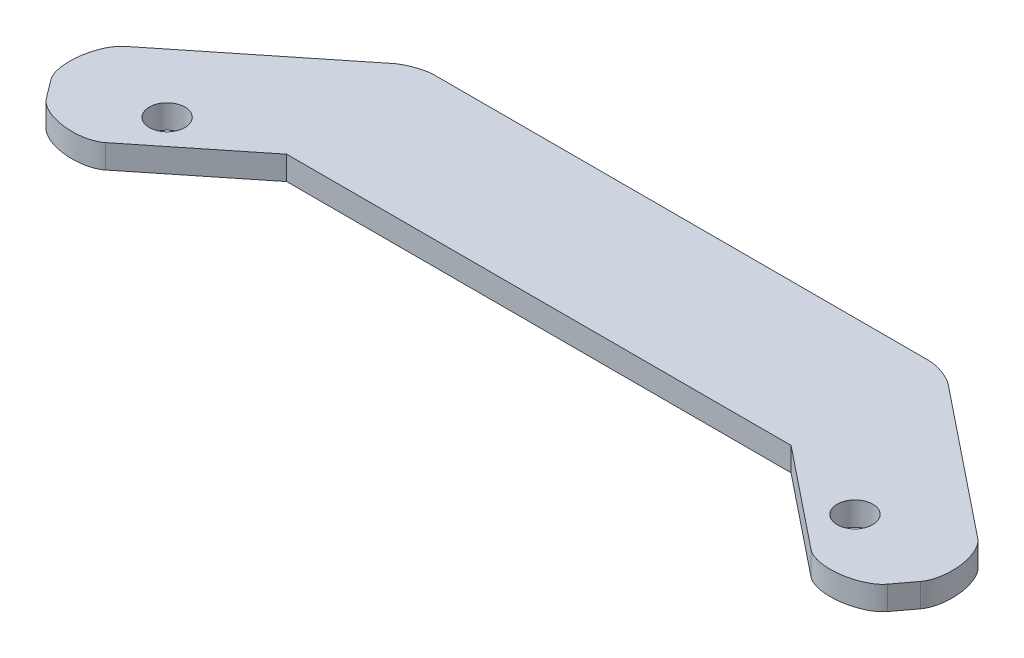
ISO-10303-21;
HEADER;
FILE_DESCRIPTION(('STEP AP214'),'2;1');
FILE_NAME('part.step','',(''),(''),'','','');
FILE_SCHEMA(('AUTOMOTIVE_DESIGN { 1 0 10303 214 1 1 1 1 }'));
ENDSEC;
DATA;
#1=APPLICATION_CONTEXT('core data for automotive mechanical design processes');
#2=APPLICATION_PROTOCOL_DEFINITION('international standard','automotive_design',2000,#1);
#3=PRODUCT_CONTEXT('',#1,'mechanical');
#4=PRODUCT('Part','Part','',(#3));
#5=PRODUCT_RELATED_PRODUCT_CATEGORY('part','',(#4));
#6=PRODUCT_DEFINITION_FORMATION('','',#4);
#7=PRODUCT_DEFINITION_CONTEXT('part definition',#1,'design');
#8=PRODUCT_DEFINITION('design','',#6,#7);
#9=PRODUCT_DEFINITION_SHAPE('','',#8);
#10=(LENGTH_UNIT() NAMED_UNIT(*) SI_UNIT(.MILLI.,.METRE.));
#11=(NAMED_UNIT(*) PLANE_ANGLE_UNIT() SI_UNIT($,.RADIAN.));
#12=(NAMED_UNIT(*) SI_UNIT($,.STERADIAN.) SOLID_ANGLE_UNIT());
#13=UNCERTAINTY_MEASURE_WITH_UNIT(LENGTH_MEASURE(1.E-05),#10,'distance_accuracy_value','');
#14=(GEOMETRIC_REPRESENTATION_CONTEXT(3) GLOBAL_UNCERTAINTY_ASSIGNED_CONTEXT((#13)) GLOBAL_UNIT_ASSIGNED_CONTEXT((#10,
#11,#12)) REPRESENTATION_CONTEXT('',''));
#15=CARTESIAN_POINT('',(0.,0.,0.));
#16=DIRECTION('',(0.,0.,1.));
#17=DIRECTION('',(1.,0.,0.));
#18=AXIS2_PLACEMENT_3D('',#15,#16,#17);
#19=CARTESIAN_POINT('',(0.,1.5875,0.));
#20=DIRECTION('',(0.,-1.,0.));
#21=DIRECTION('',(0.,0.,-1.));
#22=AXIS2_PLACEMENT_3D('',#19,#20,#21);
#23=PLANE('',#22);
#24=DIRECTION('',(0.599692544176587,0.,0.800230499580597));
#25=VECTOR('',#24,1.);
#26=CARTESIAN_POINT('',(-22.9293114019376,1.5875,-25.6132230924464));
#27=LINE('',#26,#25);
#28=CARTESIAN_POINT('',(-25.8477889660056,1.5875,-29.5076432945779));
#29=VERTEX_POINT('',#28);
#30=CARTESIAN_POINT('',(-24.8952889660056,1.5875,-28.23662607375));
#31=VERTEX_POINT('',#30);
#32=EDGE_CURVE('E168',#29,#31,#27,.T.);
#33=ORIENTED_EDGE('',*,*,#32,.T.);
#34=CARTESIAN_POINT('',(-20.3701821298372,1.5875,-27.6621663208963));
#35=CARTESIAN_POINT('',(-22.9293114019376,1.5875,-25.6132230924464));
#36=CARTESIAN_POINT('',(-24.8952889660056,1.5875,-28.23662607375));
#37=(BOUNDED_CURVE() B_SPLINE_CURVE(2,(#34,#35,#36),.UNSPECIFIED.,.F.,
.F.) B_SPLINE_CURVE_WITH_KNOTS((3,3),(0.,1.),
.UNSPECIFIED.) CURVE() GEOMETRIC_REPRESENTATION_ITEM() RATIONAL_B_SPLINE_CURVE((1.,
0.448951306137657,1.)) REPRESENTATION_ITEM(''));
#38=CARTESIAN_POINT('',(-20.3701821298372,1.5875,-27.6621663208963));
#39=VERTEX_POINT('',#38);
#40=EDGE_CURVE('E162',#31,#39,#37,.F.);
#41=ORIENTED_EDGE('',*,*,#40,.T.);
#42=DIRECTION('',(0.780624749799801,0.,-0.624999999999998));
#43=VECTOR('',#42,1.);
#44=CARTESIAN_POINT('',(-22.9293114019376,1.5875,-25.6132230924464));
#45=LINE('',#44,#43);
#46=CARTESIAN_POINT('',(-13.6349979746337,1.5875,-33.0546293424464));
#47=VERTEX_POINT('',#46);
#48=EDGE_CURVE('E153',#39,#47,#45,.T.);
#49=ORIENTED_EDGE('',*,*,#48,.T.);
#50=DIRECTION('',(1.,0.,0.));
#51=VECTOR('',#50,1.);
#52=CARTESIAN_POINT('',(-13.6349979746337,1.5875,-33.0546293424464));
#53=LINE('',#52,#51);
#54=CARTESIAN_POINT('',(20.0993770253758,1.5875,-33.0546293424464));
#55=VERTEX_POINT('',#54);
#56=EDGE_CURVE('E159',#47,#55,#53,.T.);
#57=ORIENTED_EDGE('',*,*,#56,.T.);
#58=DIRECTION('',(0.780624749799802,0.,0.624999999999998));
#59=VECTOR('',#58,1.);
#60=CARTESIAN_POINT('',(20.0993770253758,1.5875,-33.0546293424464));
#61=LINE('',#60,#59);
#62=CARTESIAN_POINT('',(26.8345611805403,1.5875,-27.6621663209275));
#63=VERTEX_POINT('',#62);
#64=EDGE_CURVE('E185',#55,#63,#61,.T.);
#65=ORIENTED_EDGE('',*,*,#64,.T.);
#66=CARTESIAN_POINT('',(31.3596680167377,1.5875,-28.2366260738199));
#67=CARTESIAN_POINT('',(29.3936904526796,1.5875,-25.6132230924464));
#68=CARTESIAN_POINT('',(26.8345611805403,1.5875,-27.6621663209275));
#69=(BOUNDED_CURVE() B_SPLINE_CURVE(2,(#66,#67,#68),.UNSPECIFIED.,.F.,
.F.) B_SPLINE_CURVE_WITH_KNOTS((3,3),(0.,1.),
.UNSPECIFIED.) CURVE() GEOMETRIC_REPRESENTATION_ITEM() RATIONAL_B_SPLINE_CURVE((1.,
0.448951306134128,1.)) REPRESENTATION_ITEM(''));
#70=CARTESIAN_POINT('',(31.3596680167377,1.5875,-28.2366260738199));
#71=VERTEX_POINT('',#70);
#72=EDGE_CURVE('E491',#63,#71,#69,.F.);
#73=ORIENTED_EDGE('',*,*,#72,.T.);
#74=DIRECTION('',(0.599692544164404,0.,-0.800230499589727));
#75=VECTOR('',#74,1.);
#76=CARTESIAN_POINT('',(29.3936904526796,1.5875,-25.6132230924464));
#77=LINE('',#76,#75);
#78=CARTESIAN_POINT('',(32.3121680167159,1.5875,-29.507643294659));
#79=VERTEX_POINT('',#78);
#80=EDGE_CURVE('E188',#71,#79,#77,.T.);
#81=ORIENTED_EDGE('',*,*,#80,.T.);
#82=CARTESIAN_POINT('',(31.7558111805193,1.5875,-33.8901507029946));
#83=CARTESIAN_POINT('',(34.1561904525817,1.5875,-31.9683091966566));
#84=CARTESIAN_POINT('',(32.3121680167159,1.5875,-29.507643294659));
#85=(BOUNDED_CURVE() B_SPLINE_CURVE(2,(#82,#83,#84),.UNSPECIFIED.,.F.,
.F.) B_SPLINE_CURVE_WITH_KNOTS((3,3),(0.,1.),
.UNSPECIFIED.) CURVE() GEOMETRIC_REPRESENTATION_ITEM() RATIONAL_B_SPLINE_CURVE((1.,
0.463559427336788,1.)) REPRESENTATION_ITEM(''));
#86=CARTESIAN_POINT('',(31.7558111805193,1.5875,-33.8901507029946));
#87=VERTEX_POINT('',#86);
#88=EDGE_CURVE('E589',#79,#87,#85,.F.);
#89=ORIENTED_EDGE('',*,*,#88,.T.);
#90=DIRECTION('',(-0.780624749799583,0.,-0.625000000000271));
#91=VECTOR('',#90,1.);
#92=CARTESIAN_POINT('',(34.1561904525817,1.5875,-31.9683091966566));
#93=LINE('',#92,#91);
#94=CARTESIAN_POINT('',(21.7726045674099,1.5875,-41.8831129230601));
#95=VERTEX_POINT('',#94);
#96=EDGE_CURVE('E207',#87,#95,#93,.T.);
#97=ORIENTED_EDGE('',*,*,#96,.T.);
#98=CARTESIAN_POINT('',(19.7882295674091,1.5875,-42.5796293424463));
#99=CARTESIAN_POINT('',(20.9026558384267,1.5875,-42.5796293424463));
#100=CARTESIAN_POINT('',(21.7726045674099,1.5875,-41.88311292306));
#101=(BOUNDED_CURVE() B_SPLINE_CURVE(2,(#98,#99,#100),.UNSPECIFIED.,.F.,
.F.) B_SPLINE_CURVE_WITH_KNOTS((3,3),(0.,1.),
.UNSPECIFIED.) CURVE() GEOMETRIC_REPRESENTATION_ITEM() RATIONAL_B_SPLINE_CURVE((1.,
0.608905408765046,1.)) REPRESENTATION_ITEM(''));
#102=CARTESIAN_POINT('',(19.7882295674091,1.5875,-42.5796293424464));
#103=VERTEX_POINT('',#102);
#104=EDGE_CURVE('E700',#95,#103,#101,.F.);
#105=ORIENTED_EDGE('',*,*,#104,.T.);
#106=DIRECTION('',(-1.,0.,0.));
#107=VECTOR('',#106,1.);
#108=CARTESIAN_POINT('',(-14.4382767876846,1.5875,-42.5796293424464));
#109=LINE('',#108,#107);
#110=CARTESIAN_POINT('',(-13.3238505166676,1.5875,-42.5796293424464));
#111=VERTEX_POINT('',#110);
#112=EDGE_CURVE('E211',#103,#111,#109,.T.);
#113=ORIENTED_EDGE('',*,*,#112,.T.);
#114=CARTESIAN_POINT('',(-15.3082255166676,1.5875,-41.8831129230607));
#115=CARTESIAN_POINT('',(-14.4382767876847,1.5875,-42.5796293424464));
#116=CARTESIAN_POINT('',(-13.3238505166676,1.5875,-42.5796293424464));
#117=(BOUNDED_CURVE() B_SPLINE_CURVE(2,(#114,#115,#116),.UNSPECIFIED.,.F.,
.F.) B_SPLINE_CURVE_WITH_KNOTS((3,3),(0.,1.),
.UNSPECIFIED.) CURVE() GEOMETRIC_REPRESENTATION_ITEM() RATIONAL_B_SPLINE_CURVE((1.,
0.608905408765084,1.)) REPRESENTATION_ITEM(''));
#118=CARTESIAN_POINT('',(-15.3082255166676,1.5875,-41.8831129230607));
#119=VERTEX_POINT('',#118);
#120=EDGE_CURVE('E73',#111,#119,#117,.F.);
#121=ORIENTED_EDGE('',*,*,#120,.T.);
#122=DIRECTION('',(-0.780624749799802,0.,0.624999999999998));
#123=VECTOR('',#122,1.);
#124=CARTESIAN_POINT('',(-18.3974979746337,1.5875,-39.4097154465857));
#125=LINE('',#124,#123);
#126=CARTESIAN_POINT('',(-25.2914321298372,1.5875,-33.8901507029529));
#127=VERTEX_POINT('',#126);
#128=EDGE_CURVE('E221',#119,#127,#125,.T.);
#129=ORIENTED_EDGE('',*,*,#128,.T.);
#130=CARTESIAN_POINT('',(-25.8477889660056,1.5875,-29.5076432945779));
#131=CARTESIAN_POINT('',(-27.6918114019376,1.5875,-31.9683091965857));
#132=CARTESIAN_POINT('',(-25.2914321298372,1.5875,-33.8901507029529));
#133=(BOUNDED_CURVE() B_SPLINE_CURVE(2,(#130,#131,#132),.UNSPECIFIED.,.F.,
.F.) B_SPLINE_CURVE_WITH_KNOTS((3,3),(0.,1.),
.UNSPECIFIED.) CURVE() GEOMETRIC_REPRESENTATION_ITEM() RATIONAL_B_SPLINE_CURVE((1.,
0.463559427333291,1.)) REPRESENTATION_ITEM(''));
#134=EDGE_CURVE('E696',#127,#29,#133,.F.);
#135=ORIENTED_EDGE('',*,*,#134,.T.);
#136=EDGE_LOOP('',(#33,#41,#49,#57,#65,#73,#81,#89,#97,#105,#113,#121,#129,#135));
#137=FACE_BOUND('',#136,.T.);
#138=CARTESIAN_POINT('',(-19.7704359382856,1.5875,-31.1927889029071));
#139=DIRECTION('',(0.,1.,0.));
#140=DIRECTION('',(0.,0.,1.));
#141=AXIS2_PLACEMENT_3D('',#138,#139,#140);
#142=CIRCLE('',#141,1.190625);
#143=CARTESIAN_POINT('',(-19.7704359382856,1.5875,-30.0021639029071));
#144=VERTEX_POINT('',#143);
#145=EDGE_CURVE('E736',#144,#144,#142,.T.);
#146=ORIENTED_EDGE('',*,*,#145,.F.);
#147=EDGE_LOOP('',(#146));
#148=FACE_BOUND('',#147,.T.);
#149=CARTESIAN_POINT('',(26.2348149890277,1.5875,-31.1927889029071));
#150=DIRECTION('',(0.,1.,0.));
#151=DIRECTION('',(0.,0.,1.));
#152=AXIS2_PLACEMENT_3D('',#149,#150,#151);
#153=CIRCLE('',#152,1.190625);
#154=CARTESIAN_POINT('',(26.2348149890277,1.5875,-30.0021639029071));
#155=VERTEX_POINT('',#154);
#156=EDGE_CURVE('E808',#155,#155,#153,.T.);
#157=ORIENTED_EDGE('',*,*,#156,.F.);
#158=EDGE_LOOP('',(#157));
#159=FACE_BOUND('',#158,.T.);
#160=ADVANCED_FACE('F43',(#137,#148,#159),#23,.F.);
#161=CARTESIAN_POINT('',(0.,0.,0.));
#162=DIRECTION('',(0.,-1.,0.));
#163=DIRECTION('',(0.,0.,-1.));
#164=AXIS2_PLACEMENT_3D('',#161,#162,#163);
#165=PLANE('',#164);
#166=CARTESIAN_POINT('',(-19.7704359382856,0.,-31.1927889029071));
#167=DIRECTION('',(0.,1.,0.));
#168=DIRECTION('',(0.,0.,1.));
#169=AXIS2_PLACEMENT_3D('',#166,#167,#168);
#170=CIRCLE('',#169,1.190625);
#171=CARTESIAN_POINT('',(-19.7704359382856,0.,-30.0021639029071));
#172=VERTEX_POINT('',#171);
#173=EDGE_CURVE('E804',#172,#172,#170,.T.);
#174=ORIENTED_EDGE('',*,*,#173,.T.);
#175=EDGE_LOOP('',(#174));
#176=FACE_BOUND('',#175,.T.);
#177=DIRECTION('',(0.780624749799801,0.,-0.624999999999998));
#178=VECTOR('',#177,1.);
#179=CARTESIAN_POINT('',(-22.9293114019376,0.,-25.6132230924464));
#180=LINE('',#179,#178);
#181=CARTESIAN_POINT('',(-20.3701821298372,0.,-27.6621663208963));
#182=VERTEX_POINT('',#181);
#183=CARTESIAN_POINT('',(-13.6349979746337,0.,-33.0546293424464));
#184=VERTEX_POINT('',#183);
#185=EDGE_CURVE('E174',#182,#184,#180,.T.);
#186=ORIENTED_EDGE('',*,*,#185,.F.);
#187=CARTESIAN_POINT('',(-24.8952889660056,0.,-28.23662607375));
#188=CARTESIAN_POINT('',(-22.9293114019376,0.,-25.6132230924464));
#189=CARTESIAN_POINT('',(-20.3701821298372,0.,-27.6621663208963));
#190=(BOUNDED_CURVE() B_SPLINE_CURVE(2,(#187,#188,#189),.UNSPECIFIED.,.F.,
.F.) B_SPLINE_CURVE_WITH_KNOTS((3,3),(0.,1.),
.UNSPECIFIED.) CURVE() GEOMETRIC_REPRESENTATION_ITEM() RATIONAL_B_SPLINE_CURVE((1.,
0.448951306137657,1.)) REPRESENTATION_ITEM(''));
#191=CARTESIAN_POINT('',(-24.8952889660056,0.,-28.23662607375));
#192=VERTEX_POINT('',#191);
#193=EDGE_CURVE('E407',#182,#192,#190,.F.);
#194=ORIENTED_EDGE('',*,*,#193,.T.);
#195=DIRECTION('',(0.599692544176587,0.,0.800230499580597));
#196=VECTOR('',#195,1.);
#197=CARTESIAN_POINT('',(-22.9293114019376,0.,-25.6132230924464));
#198=LINE('',#197,#196);
#199=CARTESIAN_POINT('',(-25.8477889660056,0.,-29.5076432945779));
#200=VERTEX_POINT('',#199);
#201=EDGE_CURVE('E730',#200,#192,#198,.T.);
#202=ORIENTED_EDGE('',*,*,#201,.F.);
#203=CARTESIAN_POINT('',(-25.2914321298372,0.,-33.8901507029529));
#204=CARTESIAN_POINT('',(-27.6918114019376,0.,-31.9683091965857));
#205=CARTESIAN_POINT('',(-25.8477889660056,0.,-29.5076432945779));
#206=(BOUNDED_CURVE() B_SPLINE_CURVE(2,(#203,#204,#205),.UNSPECIFIED.,.F.,
.F.) B_SPLINE_CURVE_WITH_KNOTS((3,3),(0.,1.),
.UNSPECIFIED.) CURVE() GEOMETRIC_REPRESENTATION_ITEM() RATIONAL_B_SPLINE_CURVE((1.,
0.463559427333291,1.)) REPRESENTATION_ITEM(''));
#207=CARTESIAN_POINT('',(-25.2914321298372,0.,-33.8901507029529));
#208=VERTEX_POINT('',#207);
#209=EDGE_CURVE('E512',#200,#208,#206,.F.);
#210=ORIENTED_EDGE('',*,*,#209,.T.);
#211=DIRECTION('',(-0.780624749799801,0.,0.624999999999998));
#212=VECTOR('',#211,1.);
#213=CARTESIAN_POINT('',(-27.6918114019376,0.,-31.9683091965857));
#214=LINE('',#213,#212);
#215=CARTESIAN_POINT('',(-15.3082255166676,0.,-41.8831129230607));
#216=VERTEX_POINT('',#215);
#217=EDGE_CURVE('E800',#216,#208,#214,.T.);
#218=ORIENTED_EDGE('',*,*,#217,.F.);
#219=CARTESIAN_POINT('',(-13.3238505166676,0.,-42.5796293424464));
#220=CARTESIAN_POINT('',(-14.4382767876847,0.,-42.5796293424464));
#221=CARTESIAN_POINT('',(-15.3082255166676,0.,-41.8831129230607));
#222=(BOUNDED_CURVE() B_SPLINE_CURVE(2,(#219,#220,#221),.UNSPECIFIED.,.F.,
.F.) B_SPLINE_CURVE_WITH_KNOTS((3,3),(0.,1.),
.UNSPECIFIED.) CURVE() GEOMETRIC_REPRESENTATION_ITEM() RATIONAL_B_SPLINE_CURVE((1.,
0.608905408765084,1.)) REPRESENTATION_ITEM(''));
#223=CARTESIAN_POINT('',(-13.3238505166676,0.,-42.5796293424464));
#224=VERTEX_POINT('',#223);
#225=EDGE_CURVE('E659',#216,#224,#222,.F.);
#226=ORIENTED_EDGE('',*,*,#225,.T.);
#227=DIRECTION('',(-1.,0.,0.));
#228=VECTOR('',#227,1.);
#229=CARTESIAN_POINT('',(-14.4382767876846,0.,-42.5796293424464));
#230=LINE('',#229,#228);
#231=CARTESIAN_POINT('',(19.7882295674091,0.,-42.5796293424464));
#232=VERTEX_POINT('',#231);
#233=EDGE_CURVE('E964',#232,#224,#230,.T.);
#234=ORIENTED_EDGE('',*,*,#233,.F.);
#235=CARTESIAN_POINT('',(21.7726045674099,0.,-41.88311292306));
#236=CARTESIAN_POINT('',(20.9026558384267,0.,-42.5796293424464));
#237=CARTESIAN_POINT('',(19.7882295674091,0.,-42.5796293424464));
#238=(BOUNDED_CURVE() B_SPLINE_CURVE(2,(#235,#236,#237),.UNSPECIFIED.,.F.,
.F.) B_SPLINE_CURVE_WITH_KNOTS((3,3),(0.,1.),
.UNSPECIFIED.) CURVE() GEOMETRIC_REPRESENTATION_ITEM() RATIONAL_B_SPLINE_CURVE((1.,
0.608905408765046,1.)) REPRESENTATION_ITEM(''));
#239=CARTESIAN_POINT('',(21.7726045674099,0.,-41.88311292306));
#240=VERTEX_POINT('',#239);
#241=EDGE_CURVE('E609',#232,#240,#238,.F.);
#242=ORIENTED_EDGE('',*,*,#241,.T.);
#243=DIRECTION('',(-0.780624749799584,0.,-0.62500000000027));
#244=VECTOR('',#243,1.);
#245=CARTESIAN_POINT('',(20.9026558384267,0.,-42.5796293424464));
#246=LINE('',#245,#244);
#247=CARTESIAN_POINT('',(31.7558111805194,0.,-33.8901507029946));
#248=VERTEX_POINT('',#247);
#249=EDGE_CURVE('E971',#248,#240,#246,.T.);
#250=ORIENTED_EDGE('',*,*,#249,.F.);
#251=CARTESIAN_POINT('',(32.3121680167159,0.,-29.507643294659));
#252=CARTESIAN_POINT('',(34.1561904525817,0.,-31.9683091966566));
#253=CARTESIAN_POINT('',(31.7558111805193,0.,-33.8901507029947));
#254=(BOUNDED_CURVE() B_SPLINE_CURVE(2,(#251,#252,#253),.UNSPECIFIED.,.F.,
.F.) B_SPLINE_CURVE_WITH_KNOTS((3,3),(0.,1.),
.UNSPECIFIED.) CURVE() GEOMETRIC_REPRESENTATION_ITEM() RATIONAL_B_SPLINE_CURVE((1.,
0.463559427336788,1.)) REPRESENTATION_ITEM(''));
#255=CARTESIAN_POINT('',(32.3121680167159,0.,-29.507643294659));
#256=VERTEX_POINT('',#255);
#257=EDGE_CURVE('E569',#248,#256,#254,.F.);
#258=ORIENTED_EDGE('',*,*,#257,.T.);
#259=DIRECTION('',(0.599692544164404,0.,-0.800230499589727));
#260=VECTOR('',#259,1.);
#261=CARTESIAN_POINT('',(29.3936904526796,0.,-25.6132230924464));
#262=LINE('',#261,#260);
#263=CARTESIAN_POINT('',(31.3596680167377,0.,-28.2366260738199));
#264=VERTEX_POINT('',#263);
#265=EDGE_CURVE('E748',#264,#256,#262,.T.);
#266=ORIENTED_EDGE('',*,*,#265,.F.);
#267=CARTESIAN_POINT('',(26.8345611805403,0.,-27.6621663209275));
#268=CARTESIAN_POINT('',(29.3936904526796,0.,-25.6132230924464));
#269=CARTESIAN_POINT('',(31.3596680167377,0.,-28.2366260738199));
#270=(BOUNDED_CURVE() B_SPLINE_CURVE(2,(#267,#268,#269),.UNSPECIFIED.,.F.,
.F.) B_SPLINE_CURVE_WITH_KNOTS((3,3),(0.,1.),
.UNSPECIFIED.) CURVE() GEOMETRIC_REPRESENTATION_ITEM() RATIONAL_B_SPLINE_CURVE((1.,
0.448951306134128,1.)) REPRESENTATION_ITEM(''));
#271=CARTESIAN_POINT('',(26.8345611805403,0.,-27.6621663209275));
#272=VERTEX_POINT('',#271);
#273=EDGE_CURVE('E470',#264,#272,#270,.F.);
#274=ORIENTED_EDGE('',*,*,#273,.T.);
#275=DIRECTION('',(0.780624749799802,0.,0.624999999999998));
#276=VECTOR('',#275,1.);
#277=CARTESIAN_POINT('',(20.0993770253758,0.,-33.0546293424464));
#278=LINE('',#277,#276);
#279=CARTESIAN_POINT('',(20.0993770253758,0.,-33.0546293424464));
#280=VERTEX_POINT('',#279);
#281=EDGE_CURVE('E734',#280,#272,#278,.T.);
#282=ORIENTED_EDGE('',*,*,#281,.F.);
#283=DIRECTION('',(1.,0.,0.));
#284=VECTOR('',#283,1.);
#285=CARTESIAN_POINT('',(-13.6349979746337,0.,-33.0546293424464));
#286=LINE('',#285,#284);
#287=EDGE_CURVE('E728',#184,#280,#286,.T.);
#288=ORIENTED_EDGE('',*,*,#287,.F.);
#289=EDGE_LOOP('',(#186,#194,#202,#210,#218,#226,#234,#242,#250,#258,#266,#274,#282,#288));
#290=FACE_BOUND('',#289,.T.);
#291=CARTESIAN_POINT('',(26.2348149890277,0.,-31.1927889029071));
#292=DIRECTION('',(0.,1.,0.));
#293=DIRECTION('',(0.,0.,1.));
#294=AXIS2_PLACEMENT_3D('',#291,#292,#293);
#295=CIRCLE('',#294,1.190625);
#296=CARTESIAN_POINT('',(26.2348149890277,0.,-30.0021639029071));
#297=VERTEX_POINT('',#296);
#298=EDGE_CURVE('E812',#297,#297,#295,.T.);
#299=ORIENTED_EDGE('',*,*,#298,.T.);
#300=EDGE_LOOP('',(#299));
#301=FACE_BOUND('',#300,.T.);
#302=ADVANCED_FACE('F238',(#176,#290,#301),#165,.T.);
#303=CARTESIAN_POINT('',(-22.9293114019376,1.5875,-25.6132230924464));
#304=DIRECTION('',(0.800230499580597,0.,-0.599692544176587));
#305=DIRECTION('',(-0.599692544176587,0.,-0.800230499580597));
#306=AXIS2_PLACEMENT_3D('',#303,#304,#305);
#307=PLANE('',#306);
#308=ORIENTED_EDGE('',*,*,#201,.T.);
#309=CARTESIAN_POINT('',(-24.8952889660056,1.666875,-28.23662607375));
#310=CARTESIAN_POINT('',(-24.8952889660056,1.08479166666667,-28.23662607375));
#311=CARTESIAN_POINT('',(-24.8952889660056,0.502708333333334,-28.23662607375));
#312=CARTESIAN_POINT('',(-24.8952889660056,-0.0793749999999998,-28.23662607375));
#313=(BOUNDED_CURVE() B_SPLINE_CURVE(3,(#309,#310,#311,#312),.UNSPECIFIED.,.F.,
.F.) B_SPLINE_CURVE_WITH_KNOTS((4,4),(-7.9375E-05,0.001666875),
.UNSPECIFIED.) CURVE() GEOMETRIC_REPRESENTATION_ITEM() RATIONAL_B_SPLINE_CURVE((1.,1.,1.,1.)) REPRESENTATION_ITEM(''));
#314=EDGE_CURVE('E458',#192,#31,#313,.F.);
#315=ORIENTED_EDGE('',*,*,#314,.T.);
#316=ORIENTED_EDGE('',*,*,#32,.F.);
#317=CARTESIAN_POINT('',(-25.8477889660056,-0.0793749999999998,-29.5076432945779));
#318=CARTESIAN_POINT('',(-25.8477889660056,0.502708333333334,-29.5076432945779));
#319=CARTESIAN_POINT('',(-25.8477889660056,1.08479166666667,-29.5076432945779));
#320=CARTESIAN_POINT('',(-25.8477889660056,1.666875,-29.5076432945779));
#321=(BOUNDED_CURVE() B_SPLINE_CURVE(3,(#317,#318,#319,#320),.UNSPECIFIED.,.F.,
.F.) B_SPLINE_CURVE_WITH_KNOTS((4,4),(-7.9375E-05,0.001666875),
.UNSPECIFIED.) CURVE() GEOMETRIC_REPRESENTATION_ITEM() RATIONAL_B_SPLINE_CURVE((1.,1.,1.,1.)) REPRESENTATION_ITEM(''));
#322=EDGE_CURVE('E704',#29,#200,#321,.F.);
#323=ORIENTED_EDGE('',*,*,#322,.T.);
#324=EDGE_LOOP('',(#308,#315,#316,#323));
#325=FACE_BOUND('',#324,.T.);
#326=ADVANCED_FACE('F430',(#325),#307,.F.);
#327=CARTESIAN_POINT('',(-22.9293114019376,1.5875,-25.6132230924464));
#328=DIRECTION('',(-0.624999999999998,0.,-0.780624749799801));
#329=DIRECTION('',(-0.780624749799801,0.,0.624999999999998));
#330=AXIS2_PLACEMENT_3D('',#327,#328,#329);
#331=PLANE('',#330);
#332=ORIENTED_EDGE('',*,*,#48,.F.);
#333=CARTESIAN_POINT('',(-20.3701821298372,-0.0793749999999998,-27.6621663208963));
#334=CARTESIAN_POINT('',(-20.3701821298372,0.502708333333334,-27.6621663208963));
#335=CARTESIAN_POINT('',(-20.3701821298372,1.08479166666667,-27.6621663208963));
#336=CARTESIAN_POINT('',(-20.3701821298372,1.666875,-27.6621663208963));
#337=(BOUNDED_CURVE() B_SPLINE_CURVE(3,(#333,#334,#335,#336),.UNSPECIFIED.,.F.,
.F.) B_SPLINE_CURVE_WITH_KNOTS((4,4),(-7.9375E-05,0.001666875),
.UNSPECIFIED.) CURVE() GEOMETRIC_REPRESENTATION_ITEM() RATIONAL_B_SPLINE_CURVE((1.,1.,1.,1.)) REPRESENTATION_ITEM(''));
#338=EDGE_CURVE('E178',#39,#182,#337,.F.);
#339=ORIENTED_EDGE('',*,*,#338,.T.);
#340=ORIENTED_EDGE('',*,*,#185,.T.);
#341=DIRECTION('',(0.,-1.,0.));
#342=VECTOR('',#341,1.);
#343=CARTESIAN_POINT('',(-13.6349979746337,1.5875,-33.0546293424464));
#344=LINE('',#343,#342);
#345=EDGE_CURVE('E171',#47,#184,#344,.T.);
#346=ORIENTED_EDGE('',*,*,#345,.F.);
#347=EDGE_LOOP('',(#332,#339,#340,#346));
#348=FACE_BOUND('',#347,.T.);
#349=ADVANCED_FACE('F172',(#348),#331,.F.);
#350=CARTESIAN_POINT('',(-13.6349979746337,1.5875,-33.0546293424464));
#351=DIRECTION('',(0.,0.,-1.));
#352=DIRECTION('',(-1.,0.,0.));
#353=AXIS2_PLACEMENT_3D('',#350,#351,#352);
#354=PLANE('',#353);
#355=ORIENTED_EDGE('',*,*,#287,.T.);
#356=DIRECTION('',(0.,-1.,0.));
#357=VECTOR('',#356,1.);
#358=CARTESIAN_POINT('',(20.0993770253758,1.5875,-33.0546293424464));
#359=LINE('',#358,#357);
#360=EDGE_CURVE('E179',#55,#280,#359,.T.);
#361=ORIENTED_EDGE('',*,*,#360,.F.);
#362=ORIENTED_EDGE('',*,*,#56,.F.);
#363=ORIENTED_EDGE('',*,*,#345,.T.);
#364=EDGE_LOOP('',(#355,#361,#362,#363));
#365=FACE_BOUND('',#364,.T.);
#366=ADVANCED_FACE('F181',(#365),#354,.F.);
#367=CARTESIAN_POINT('',(20.0993770253758,1.5875,-33.0546293424464));
#368=DIRECTION('',(0.624999999999998,0.,-0.780624749799802));
#369=DIRECTION('',(-0.780624749799802,0.,-0.624999999999998));
#370=AXIS2_PLACEMENT_3D('',#367,#368,#369);
#371=PLANE('',#370);
#372=ORIENTED_EDGE('',*,*,#281,.T.);
#373=CARTESIAN_POINT('',(26.8345611805403,1.666875,-27.6621663209275));
#374=CARTESIAN_POINT('',(26.8345611805403,1.08479166666667,-27.6621663209275));
#375=CARTESIAN_POINT('',(26.8345611805403,0.502708333333334,-27.6621663209275));
#376=CARTESIAN_POINT('',(26.8345611805403,-0.0793749999999998,-27.6621663209275));
#377=(BOUNDED_CURVE() B_SPLINE_CURVE(3,(#373,#374,#375,#376),.UNSPECIFIED.,.F.,
.F.) B_SPLINE_CURVE_WITH_KNOTS((4,4),(-7.9375E-05,0.001666875),
.UNSPECIFIED.) CURVE() GEOMETRIC_REPRESENTATION_ITEM() RATIONAL_B_SPLINE_CURVE((1.,1.,1.,1.)) REPRESENTATION_ITEM(''));
#378=EDGE_CURVE('E317',#272,#63,#377,.F.);
#379=ORIENTED_EDGE('',*,*,#378,.T.);
#380=ORIENTED_EDGE('',*,*,#64,.F.);
#381=ORIENTED_EDGE('',*,*,#360,.T.);
#382=EDGE_LOOP('',(#372,#379,#380,#381));
#383=FACE_BOUND('',#382,.T.);
#384=ADVANCED_FACE('F299',(#383),#371,.F.);
#385=CARTESIAN_POINT('',(29.3936904526796,1.5875,-25.6132230924464));
#386=DIRECTION('',(-0.800230499589727,0.,-0.599692544164404));
#387=DIRECTION('',(-0.599692544164404,0.,0.800230499589727));
#388=AXIS2_PLACEMENT_3D('',#385,#386,#387);
#389=PLANE('',#388);
#390=ORIENTED_EDGE('',*,*,#80,.F.);
#391=CARTESIAN_POINT('',(31.3596680167377,-0.0793749999999998,-28.2366260738199));
#392=CARTESIAN_POINT('',(31.3596680167377,0.502708333333334,-28.2366260738199));
#393=CARTESIAN_POINT('',(31.3596680167377,1.08479166666667,-28.2366260738199));
#394=CARTESIAN_POINT('',(31.3596680167377,1.666875,-28.2366260738199));
#395=(BOUNDED_CURVE() B_SPLINE_CURVE(3,(#391,#392,#393,#394),.UNSPECIFIED.,.F.,
.F.) B_SPLINE_CURVE_WITH_KNOTS((4,4),(-7.9375E-05,0.001666875),
.UNSPECIFIED.) CURVE() GEOMETRIC_REPRESENTATION_ITEM() RATIONAL_B_SPLINE_CURVE((1.,1.,1.,1.)) REPRESENTATION_ITEM(''));
#396=EDGE_CURVE('E481',#71,#264,#395,.F.);
#397=ORIENTED_EDGE('',*,*,#396,.T.);
#398=ORIENTED_EDGE('',*,*,#265,.T.);
#399=CARTESIAN_POINT('',(32.3121680167159,1.666875,-29.507643294659));
#400=CARTESIAN_POINT('',(32.3121680167159,1.08479166666667,-29.507643294659));
#401=CARTESIAN_POINT('',(32.3121680167159,0.502708333333334,-29.507643294659));
#402=CARTESIAN_POINT('',(32.3121680167159,-0.0793749999999998,-29.507643294659));
#403=(BOUNDED_CURVE() B_SPLINE_CURVE(3,(#399,#400,#401,#402),.UNSPECIFIED.,.F.,
.F.) B_SPLINE_CURVE_WITH_KNOTS((4,4),(-7.9375E-05,0.001666875),
.UNSPECIFIED.) CURVE() GEOMETRIC_REPRESENTATION_ITEM() RATIONAL_B_SPLINE_CURVE((1.,1.,1.,1.)) REPRESENTATION_ITEM(''));
#404=EDGE_CURVE('E281',#256,#79,#403,.F.);
#405=ORIENTED_EDGE('',*,*,#404,.T.);
#406=EDGE_LOOP('',(#390,#397,#398,#405));
#407=FACE_BOUND('',#406,.T.);
#408=ADVANCED_FACE('F288',(#407),#389,.F.);
#409=CARTESIAN_POINT('',(20.9026558384267,1.5875,-42.5796293424464));
#410=DIRECTION('',(-0.62500000000027,0.,0.780624749799584));
#411=DIRECTION('',(0.780624749799584,0.,0.62500000000027));
#412=AXIS2_PLACEMENT_3D('',#409,#410,#411);
#413=PLANE('',#412);
#414=ORIENTED_EDGE('',*,*,#96,.F.);
#415=CARTESIAN_POINT('',(31.7558111805193,-0.0793749999999998,-33.8901507029947));
#416=CARTESIAN_POINT('',(31.7558111805193,0.502708333333334,-33.8901507029947));
#417=CARTESIAN_POINT('',(31.7558111805193,1.08479166666667,-33.8901507029947));
#418=CARTESIAN_POINT('',(31.7558111805193,1.666875,-33.8901507029947));
#419=(BOUNDED_CURVE() B_SPLINE_CURVE(3,(#415,#416,#417,#418),.UNSPECIFIED.,.F.,
.F.) B_SPLINE_CURVE_WITH_KNOTS((4,4),(-7.9375E-05,0.001666875),
.UNSPECIFIED.) CURVE() GEOMETRIC_REPRESENTATION_ITEM() RATIONAL_B_SPLINE_CURVE((1.,1.,1.,1.)) REPRESENTATION_ITEM(''));
#420=EDGE_CURVE('E370',#87,#248,#419,.F.);
#421=ORIENTED_EDGE('',*,*,#420,.T.);
#422=ORIENTED_EDGE('',*,*,#249,.T.);
#423=CARTESIAN_POINT('',(21.7726045674099,1.666875,-41.88311292306));
#424=CARTESIAN_POINT('',(21.7726045674099,1.08479166666667,-41.88311292306));
#425=CARTESIAN_POINT('',(21.7726045674099,0.502708333333334,-41.88311292306));
#426=CARTESIAN_POINT('',(21.7726045674099,-0.0793749999999998,-41.88311292306));
#427=(BOUNDED_CURVE() B_SPLINE_CURVE(3,(#423,#424,#425,#426),.UNSPECIFIED.,.F.,
.F.) B_SPLINE_CURVE_WITH_KNOTS((4,4),(-7.9375E-05,0.001666875),
.UNSPECIFIED.) CURVE() GEOMETRIC_REPRESENTATION_ITEM() RATIONAL_B_SPLINE_CURVE((1.,1.,1.,1.)) REPRESENTATION_ITEM(''));
#428=EDGE_CURVE('E358',#240,#95,#427,.F.);
#429=ORIENTED_EDGE('',*,*,#428,.T.);
#430=EDGE_LOOP('',(#414,#421,#422,#429));
#431=FACE_BOUND('',#430,.T.);
#432=ADVANCED_FACE('F298',(#431),#413,.F.);
#433=CARTESIAN_POINT('',(-14.4382767876846,1.5875,-42.5796293424464));
#434=DIRECTION('',(0.,0.,1.));
#435=DIRECTION('',(1.,0.,0.));
#436=AXIS2_PLACEMENT_3D('',#433,#434,#435);
#437=PLANE('',#436);
#438=ORIENTED_EDGE('',*,*,#112,.F.);
#439=CARTESIAN_POINT('',(19.7882295674091,-0.0793749999999998,-42.5796293424464));
#440=CARTESIAN_POINT('',(19.7882295674091,0.502708333333334,-42.5796293424464));
#441=CARTESIAN_POINT('',(19.7882295674091,1.08479166666667,-42.5796293424464));
#442=CARTESIAN_POINT('',(19.7882295674091,1.666875,-42.5796293424464));
#443=(BOUNDED_CURVE() B_SPLINE_CURVE(3,(#439,#440,#441,#442),.UNSPECIFIED.,.F.,
.F.) B_SPLINE_CURVE_WITH_KNOTS((4,4),(-7.9375E-05,0.001666875),
.UNSPECIFIED.) CURVE() GEOMETRIC_REPRESENTATION_ITEM() RATIONAL_B_SPLINE_CURVE((1.,1.,1.,1.)) REPRESENTATION_ITEM(''));
#444=EDGE_CURVE('E12',#103,#232,#443,.F.);
#445=ORIENTED_EDGE('',*,*,#444,.T.);
#446=ORIENTED_EDGE('',*,*,#233,.T.);
#447=CARTESIAN_POINT('',(-13.3238505166676,1.666875,-42.5796293424464));
#448=CARTESIAN_POINT('',(-13.3238505166676,1.08479166666667,-42.5796293424464));
#449=CARTESIAN_POINT('',(-13.3238505166676,0.502708333333334,-42.5796293424464));
#450=CARTESIAN_POINT('',(-13.3238505166676,-0.0793749999999998,-42.5796293424464));
#451=(BOUNDED_CURVE() B_SPLINE_CURVE(3,(#447,#448,#449,#450),.UNSPECIFIED.,.F.,
.F.) B_SPLINE_CURVE_WITH_KNOTS((4,4),(-7.9375E-05,0.001666875),
.UNSPECIFIED.) CURVE() GEOMETRIC_REPRESENTATION_ITEM() RATIONAL_B_SPLINE_CURVE((1.,1.,1.,1.)) REPRESENTATION_ITEM(''));
#452=EDGE_CURVE('E58',#224,#111,#451,.F.);
#453=ORIENTED_EDGE('',*,*,#452,.T.);
#454=EDGE_LOOP('',(#438,#445,#446,#453));
#455=FACE_BOUND('',#454,.T.);
#456=ADVANCED_FACE('F342',(#455),#437,.F.);
#457=CARTESIAN_POINT('',(-27.6918114019376,1.5875,-31.9683091965857));
#458=DIRECTION('',(0.624999999999998,0.,0.780624749799801));
#459=DIRECTION('',(0.780624749799801,0.,-0.624999999999998));
#460=AXIS2_PLACEMENT_3D('',#457,#458,#459);
#461=PLANE('',#460);
#462=ORIENTED_EDGE('',*,*,#217,.T.);
#463=CARTESIAN_POINT('',(-25.2914321298372,1.666875,-33.8901507029529));
#464=CARTESIAN_POINT('',(-25.2914321298372,1.08479166666667,-33.8901507029529));
#465=CARTESIAN_POINT('',(-25.2914321298372,0.502708333333334,-33.8901507029529));
#466=CARTESIAN_POINT('',(-25.2914321298372,-0.0793749999999998,-33.8901507029529));
#467=(BOUNDED_CURVE() B_SPLINE_CURVE(3,(#463,#464,#465,#466),.UNSPECIFIED.,.F.,
.F.) B_SPLINE_CURVE_WITH_KNOTS((4,4),(-7.9375E-05,0.001666875),
.UNSPECIFIED.) CURVE() GEOMETRIC_REPRESENTATION_ITEM() RATIONAL_B_SPLINE_CURVE((1.,1.,1.,1.)) REPRESENTATION_ITEM(''));
#468=EDGE_CURVE('E65',#208,#127,#467,.F.);
#469=ORIENTED_EDGE('',*,*,#468,.T.);
#470=ORIENTED_EDGE('',*,*,#128,.F.);
#471=CARTESIAN_POINT('',(-15.3082255166676,-0.0793749999999998,-41.8831129230607));
#472=CARTESIAN_POINT('',(-15.3082255166676,0.502708333333334,-41.8831129230607));
#473=CARTESIAN_POINT('',(-15.3082255166676,1.08479166666667,-41.8831129230607));
#474=CARTESIAN_POINT('',(-15.3082255166676,1.666875,-41.8831129230607));
#475=(BOUNDED_CURVE() B_SPLINE_CURVE(3,(#471,#472,#473,#474),.UNSPECIFIED.,.F.,
.F.) B_SPLINE_CURVE_WITH_KNOTS((4,4),(-7.9375E-05,0.001666875),
.UNSPECIFIED.) CURVE() GEOMETRIC_REPRESENTATION_ITEM() RATIONAL_B_SPLINE_CURVE((1.,1.,1.,1.)) REPRESENTATION_ITEM(''));
#476=EDGE_CURVE('E329',#119,#216,#475,.F.);
#477=ORIENTED_EDGE('',*,*,#476,.T.);
#478=EDGE_LOOP('',(#462,#469,#470,#477));
#479=FACE_BOUND('',#478,.T.);
#480=ADVANCED_FACE('F334',(#479),#461,.F.);
#481=CARTESIAN_POINT('',(-19.7704359382856,1.5875,-31.1927889029071));
#482=DIRECTION('',(0.,-1.,0.));
#483=DIRECTION('',(0.,0.,-1.));
#484=AXIS2_PLACEMENT_3D('',#481,#482,#483);
#485=CYLINDRICAL_SURFACE('',#484,1.190625);
#486=ORIENTED_EDGE('',*,*,#145,.T.);
#487=EDGE_LOOP('',(#486));
#488=FACE_BOUND('',#487,.T.);
#489=ORIENTED_EDGE('',*,*,#173,.F.);
#490=EDGE_LOOP('',(#489));
#491=FACE_BOUND('',#490,.T.);
#492=ADVANCED_FACE('F239',(#488,#491),#485,.F.);
#493=CARTESIAN_POINT('',(26.2348149890277,1.5875,-31.1927889029071));
#494=DIRECTION('',(0.,-1.,0.));
#495=DIRECTION('',(0.,0.,-1.));
#496=AXIS2_PLACEMENT_3D('',#493,#494,#495);
#497=CYLINDRICAL_SURFACE('',#496,1.190625);
#498=ORIENTED_EDGE('',*,*,#156,.T.);
#499=EDGE_LOOP('',(#498));
#500=FACE_BOUND('',#499,.T.);
#501=ORIENTED_EDGE('',*,*,#298,.F.);
#502=EDGE_LOOP('',(#501));
#503=FACE_BOUND('',#502,.T.);
#504=ADVANCED_FACE('F429',(#500,#503),#497,.F.);
#505=CARTESIAN_POINT('',(-20.3701821298372,1.666875,-27.6621663208963));
#506=CARTESIAN_POINT('',(-20.3701821298372,1.08479166666667,-27.6621663208963));
#507=CARTESIAN_POINT('',(-20.3701821298372,0.502708333333334,-27.6621663208963));
#508=CARTESIAN_POINT('',(-20.3701821298372,-0.0793749999999998,-27.6621663208963));
#509=CARTESIAN_POINT('',(-22.9293114019376,1.666875,-25.6132230924464));
#510=CARTESIAN_POINT('',(-22.9293114019376,1.08479166666667,-25.6132230924464));
#511=CARTESIAN_POINT('',(-22.9293114019376,0.502708333333334,-25.6132230924464));
#512=CARTESIAN_POINT('',(-22.9293114019376,-0.0793749999999998,-25.6132230924464));
#513=CARTESIAN_POINT('',(-24.8952889660056,1.666875,-28.23662607375));
#514=CARTESIAN_POINT('',(-24.8952889660056,1.08479166666667,-28.23662607375));
#515=CARTESIAN_POINT('',(-24.8952889660056,0.502708333333334,-28.23662607375));
#516=CARTESIAN_POINT('',(-24.8952889660056,-0.0793749999999998,-28.23662607375));
#517=(BOUNDED_SURFACE() B_SPLINE_SURFACE(2,3,((#505,#506,#507,#508),(#509,#510,#511,#512),(#513,
#514,#515,#516)),.UNSPECIFIED.,.F.,.F.,.F.) B_SPLINE_SURFACE_WITH_KNOTS((3,3),(4,4),(0.,1.),
(-7.9375E-05,0.001666875),
.UNSPECIFIED.) GEOMETRIC_REPRESENTATION_ITEM() RATIONAL_B_SPLINE_SURFACE(((1.,1.,1.,1.),
(0.448951306137657,0.448951306137657,0.448951306137657,0.448951306137657),(1.,1.,1.,1.))) REPRESENTATION_ITEM('') SURFACE());
#518=ORIENTED_EDGE('',*,*,#40,.F.);
#519=ORIENTED_EDGE('',*,*,#314,.F.);
#520=ORIENTED_EDGE('',*,*,#193,.F.);
#521=ORIENTED_EDGE('',*,*,#338,.F.);
#522=EDGE_LOOP('',(#518,#519,#520,#521));
#523=FACE_BOUND('',#522,.T.);
#524=ADVANCED_FACE('F414',(#523),#517,.T.);
#525=CARTESIAN_POINT('',(31.3596680167377,1.666875,-28.2366260738199));
#526=CARTESIAN_POINT('',(31.3596680167377,1.08479166666667,-28.2366260738199));
#527=CARTESIAN_POINT('',(31.3596680167377,0.502708333333334,-28.2366260738199));
#528=CARTESIAN_POINT('',(31.3596680167377,-0.0793749999999998,-28.2366260738199));
#529=CARTESIAN_POINT('',(29.3936904526796,1.666875,-25.6132230924464));
#530=CARTESIAN_POINT('',(29.3936904526796,1.08479166666667,-25.6132230924464));
#531=CARTESIAN_POINT('',(29.3936904526796,0.502708333333334,-25.6132230924464));
#532=CARTESIAN_POINT('',(29.3936904526796,-0.0793749999999998,-25.6132230924464));
#533=CARTESIAN_POINT('',(26.8345611805403,1.666875,-27.6621663209275));
#534=CARTESIAN_POINT('',(26.8345611805403,1.08479166666667,-27.6621663209275));
#535=CARTESIAN_POINT('',(26.8345611805403,0.502708333333334,-27.6621663209275));
#536=CARTESIAN_POINT('',(26.8345611805403,-0.0793749999999998,-27.6621663209275));
#537=(BOUNDED_SURFACE() B_SPLINE_SURFACE(2,3,((#525,#526,#527,#528),(#529,#530,#531,#532),(#533,
#534,#535,#536)),.UNSPECIFIED.,.F.,.F.,.F.) B_SPLINE_SURFACE_WITH_KNOTS((3,3),(4,4),(0.,1.),
(-7.9375E-05,0.001666875),
.UNSPECIFIED.) GEOMETRIC_REPRESENTATION_ITEM() RATIONAL_B_SPLINE_SURFACE(((1.,1.,1.,1.),
(0.448951306134128,0.448951306134128,0.448951306134128,0.448951306134128),(1.,1.,1.,1.))) REPRESENTATION_ITEM('') SURFACE());
#538=ORIENTED_EDGE('',*,*,#72,.F.);
#539=ORIENTED_EDGE('',*,*,#378,.F.);
#540=ORIENTED_EDGE('',*,*,#273,.F.);
#541=ORIENTED_EDGE('',*,*,#396,.F.);
#542=EDGE_LOOP('',(#538,#539,#540,#541));
#543=FACE_BOUND('',#542,.T.);
#544=ADVANCED_FACE('F428',(#543),#537,.T.);
#545=CARTESIAN_POINT('',(-25.8477889660056,1.666875,-29.5076432945779));
#546=CARTESIAN_POINT('',(-25.8477889660056,1.08479166666667,-29.5076432945779));
#547=CARTESIAN_POINT('',(-25.8477889660056,0.502708333333334,-29.5076432945779));
#548=CARTESIAN_POINT('',(-25.8477889660056,-0.0793749999999998,-29.5076432945779));
#549=CARTESIAN_POINT('',(-27.6918114019376,1.666875,-31.9683091965857));
#550=CARTESIAN_POINT('',(-27.6918114019376,1.08479166666667,-31.9683091965857));
#551=CARTESIAN_POINT('',(-27.6918114019376,0.502708333333334,-31.9683091965857));
#552=CARTESIAN_POINT('',(-27.6918114019376,-0.0793749999999998,-31.9683091965857));
#553=CARTESIAN_POINT('',(-25.2914321298372,1.666875,-33.8901507029529));
#554=CARTESIAN_POINT('',(-25.2914321298372,1.08479166666667,-33.8901507029529));
#555=CARTESIAN_POINT('',(-25.2914321298372,0.502708333333334,-33.8901507029529));
#556=CARTESIAN_POINT('',(-25.2914321298372,-0.0793749999999998,-33.8901507029529));
#557=(BOUNDED_SURFACE() B_SPLINE_SURFACE(2,3,((#545,#546,#547,#548),(#549,#550,#551,#552),(#553,
#554,#555,#556)),.UNSPECIFIED.,.F.,.F.,.F.) B_SPLINE_SURFACE_WITH_KNOTS((3,3),(4,4),(0.,1.),
(-7.9375E-05,0.001666875),
.UNSPECIFIED.) GEOMETRIC_REPRESENTATION_ITEM() RATIONAL_B_SPLINE_SURFACE(((1.,1.,1.,1.),
(0.463559427333291,0.463559427333291,0.463559427333291,0.463559427333291),(1.,1.,1.,1.))) REPRESENTATION_ITEM('') SURFACE());
#558=ORIENTED_EDGE('',*,*,#134,.F.);
#559=ORIENTED_EDGE('',*,*,#468,.F.);
#560=ORIENTED_EDGE('',*,*,#209,.F.);
#561=ORIENTED_EDGE('',*,*,#322,.F.);
#562=EDGE_LOOP('',(#558,#559,#560,#561));
#563=FACE_BOUND('',#562,.T.);
#564=ADVANCED_FACE('F519',(#563),#557,.T.);
#565=CARTESIAN_POINT('',(31.7558111805193,1.666875,-33.8901507029947));
#566=CARTESIAN_POINT('',(31.7558111805193,1.08479166666667,-33.8901507029947));
#567=CARTESIAN_POINT('',(31.7558111805193,0.502708333333334,-33.8901507029947));
#568=CARTESIAN_POINT('',(31.7558111805193,-0.0793749999999998,-33.8901507029947));
#569=CARTESIAN_POINT('',(34.1561904525817,1.666875,-31.9683091966566));
#570=CARTESIAN_POINT('',(34.1561904525817,1.08479166666667,-31.9683091966566));
#571=CARTESIAN_POINT('',(34.1561904525817,0.502708333333334,-31.9683091966566));
#572=CARTESIAN_POINT('',(34.1561904525817,-0.0793749999999998,-31.9683091966566));
#573=CARTESIAN_POINT('',(32.3121680167159,1.666875,-29.507643294659));
#574=CARTESIAN_POINT('',(32.3121680167159,1.08479166666667,-29.507643294659));
#575=CARTESIAN_POINT('',(32.3121680167159,0.502708333333334,-29.507643294659));
#576=CARTESIAN_POINT('',(32.3121680167159,-0.0793749999999998,-29.507643294659));
#577=(BOUNDED_SURFACE() B_SPLINE_SURFACE(2,3,((#565,#566,#567,#568),(#569,#570,#571,#572),(#573,
#574,#575,#576)),.UNSPECIFIED.,.F.,.F.,.F.) B_SPLINE_SURFACE_WITH_KNOTS((3,3),(4,4),(0.,1.),
(-7.9375E-05,0.001666875),
.UNSPECIFIED.) GEOMETRIC_REPRESENTATION_ITEM() RATIONAL_B_SPLINE_SURFACE(((1.,1.,1.,1.),
(0.463559427336788,0.463559427336788,0.463559427336788,0.463559427336788),(1.,1.,1.,1.))) REPRESENTATION_ITEM('') SURFACE());
#578=ORIENTED_EDGE('',*,*,#88,.F.);
#579=ORIENTED_EDGE('',*,*,#404,.F.);
#580=ORIENTED_EDGE('',*,*,#257,.F.);
#581=ORIENTED_EDGE('',*,*,#420,.F.);
#582=EDGE_LOOP('',(#578,#579,#580,#581));
#583=FACE_BOUND('',#582,.T.);
#584=ADVANCED_FACE('F533',(#583),#577,.T.);
#585=CARTESIAN_POINT('',(19.7882295674091,1.666875,-42.5796293424464));
#586=CARTESIAN_POINT('',(19.7882295674091,1.08479166666667,-42.5796293424464));
#587=CARTESIAN_POINT('',(19.7882295674091,0.502708333333334,-42.5796293424464));
#588=CARTESIAN_POINT('',(19.7882295674091,-0.0793749999999998,-42.5796293424464));
#589=CARTESIAN_POINT('',(20.9026558384267,1.666875,-42.5796293424464));
#590=CARTESIAN_POINT('',(20.9026558384267,1.08479166666667,-42.5796293424464));
#591=CARTESIAN_POINT('',(20.9026558384267,0.502708333333334,-42.5796293424464));
#592=CARTESIAN_POINT('',(20.9026558384267,-0.0793749999999998,-42.5796293424464));
#593=CARTESIAN_POINT('',(21.7726045674099,1.666875,-41.88311292306));
#594=CARTESIAN_POINT('',(21.7726045674099,1.08479166666667,-41.88311292306));
#595=CARTESIAN_POINT('',(21.7726045674099,0.502708333333334,-41.88311292306));
#596=CARTESIAN_POINT('',(21.7726045674099,-0.0793749999999998,-41.88311292306));
#597=(BOUNDED_SURFACE() B_SPLINE_SURFACE(2,3,((#585,#586,#587,#588),(#589,#590,#591,#592),(#593,
#594,#595,#596)),.UNSPECIFIED.,.F.,.F.,.F.) B_SPLINE_SURFACE_WITH_KNOTS((3,3),(4,4),(0.,1.),
(-7.9375E-05,0.001666875),
.UNSPECIFIED.) GEOMETRIC_REPRESENTATION_ITEM() RATIONAL_B_SPLINE_SURFACE(((1.,1.,1.,1.),
(0.608905408765046,0.608905408765046,0.608905408765046,0.608905408765046),(1.,1.,1.,1.))) REPRESENTATION_ITEM('') SURFACE());
#598=ORIENTED_EDGE('',*,*,#104,.F.);
#599=ORIENTED_EDGE('',*,*,#428,.F.);
#600=ORIENTED_EDGE('',*,*,#241,.F.);
#601=ORIENTED_EDGE('',*,*,#444,.F.);
#602=EDGE_LOOP('',(#598,#599,#600,#601));
#603=FACE_BOUND('',#602,.T.);
#604=ADVANCED_FACE('F615',(#603),#597,.T.);
#605=CARTESIAN_POINT('',(-15.3082255166676,1.666875,-41.8831129230607));
#606=CARTESIAN_POINT('',(-15.3082255166676,1.08479166666667,-41.8831129230607));
#607=CARTESIAN_POINT('',(-15.3082255166676,0.502708333333334,-41.8831129230607));
#608=CARTESIAN_POINT('',(-15.3082255166676,-0.0793749999999998,-41.8831129230607));
#609=CARTESIAN_POINT('',(-14.4382767876847,1.666875,-42.5796293424464));
#610=CARTESIAN_POINT('',(-14.4382767876847,1.08479166666667,-42.5796293424464));
#611=CARTESIAN_POINT('',(-14.4382767876847,0.502708333333334,-42.5796293424464));
#612=CARTESIAN_POINT('',(-14.4382767876847,-0.0793749999999998,-42.5796293424464));
#613=CARTESIAN_POINT('',(-13.3238505166676,1.666875,-42.5796293424464));
#614=CARTESIAN_POINT('',(-13.3238505166676,1.08479166666667,-42.5796293424464));
#615=CARTESIAN_POINT('',(-13.3238505166676,0.502708333333334,-42.5796293424464));
#616=CARTESIAN_POINT('',(-13.3238505166676,-0.0793749999999998,-42.5796293424464));
#617=(BOUNDED_SURFACE() B_SPLINE_SURFACE(2,3,((#605,#606,#607,#608),(#609,#610,#611,#612),(#613,
#614,#615,#616)),.UNSPECIFIED.,.F.,.F.,.F.) B_SPLINE_SURFACE_WITH_KNOTS((3,3),(4,4),(0.,1.),
(-7.9375E-05,0.001666875),
.UNSPECIFIED.) GEOMETRIC_REPRESENTATION_ITEM() RATIONAL_B_SPLINE_SURFACE(((1.,1.,1.,1.),
(0.608905408765084,0.608905408765084,0.608905408765084,0.608905408765084),(1.,1.,1.,1.))) REPRESENTATION_ITEM('') SURFACE());
#618=ORIENTED_EDGE('',*,*,#120,.F.);
#619=ORIENTED_EDGE('',*,*,#452,.F.);
#620=ORIENTED_EDGE('',*,*,#225,.F.);
#621=ORIENTED_EDGE('',*,*,#476,.F.);
#622=EDGE_LOOP('',(#618,#619,#620,#621));
#623=FACE_BOUND('',#622,.T.);
#624=ADVANCED_FACE('F46',(#623),#617,.T.);
#625=CLOSED_SHELL('',(#160,#302,#326,#349,#366,#384,#408,#432,#456,#480,#492,#504,#524,#544,
#564,#584,#604,#624));
#626=MANIFOLD_SOLID_BREP('B2',#625);
#627=ADVANCED_BREP_SHAPE_REPRESENTATION('',(#18,#626),#14);
#628=SHAPE_DEFINITION_REPRESENTATION(#9,#627);
ENDSEC;
END-ISO-10303-21;
